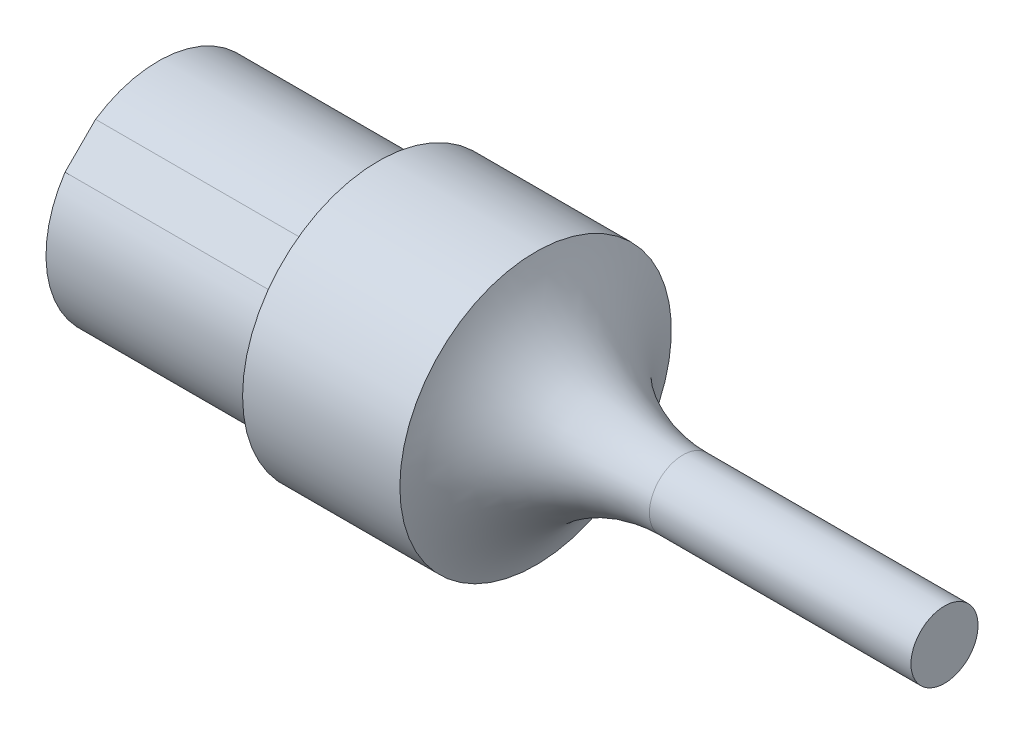
ISO-10303-21;
HEADER;
FILE_DESCRIPTION(('STEP AP214'),'2;1');
FILE_NAME('part.step','',(''),(''),'','','');
FILE_SCHEMA(('AUTOMOTIVE_DESIGN { 1 0 10303 214 1 1 1 1 }'));
ENDSEC;
DATA;
#1=APPLICATION_CONTEXT('core data for automotive mechanical design processes');
#2=APPLICATION_PROTOCOL_DEFINITION('international standard','automotive_design',2000,#1);
#3=PRODUCT_CONTEXT('',#1,'mechanical');
#4=PRODUCT('Part','Part','',(#3));
#5=PRODUCT_RELATED_PRODUCT_CATEGORY('part','',(#4));
#6=PRODUCT_DEFINITION_FORMATION('','',#4);
#7=PRODUCT_DEFINITION_CONTEXT('part definition',#1,'design');
#8=PRODUCT_DEFINITION('design','',#6,#7);
#9=PRODUCT_DEFINITION_SHAPE('','',#8);
#10=(LENGTH_UNIT() NAMED_UNIT(*) SI_UNIT(.MILLI.,.METRE.));
#11=(NAMED_UNIT(*) PLANE_ANGLE_UNIT() SI_UNIT($,.RADIAN.));
#12=(NAMED_UNIT(*) SI_UNIT($,.STERADIAN.) SOLID_ANGLE_UNIT());
#13=UNCERTAINTY_MEASURE_WITH_UNIT(LENGTH_MEASURE(1.E-05),#10,'distance_accuracy_value','');
#14=(GEOMETRIC_REPRESENTATION_CONTEXT(3) GLOBAL_UNCERTAINTY_ASSIGNED_CONTEXT((#13)) GLOBAL_UNIT_ASSIGNED_CONTEXT((#10,
#11,#12)) REPRESENTATION_CONTEXT('',''));
#15=CARTESIAN_POINT('',(0.,0.,0.));
#16=DIRECTION('',(0.,0.,1.));
#17=DIRECTION('',(1.,0.,0.));
#18=AXIS2_PLACEMENT_3D('',#15,#16,#17);
#19=CARTESIAN_POINT('',(-32.6819687334393,0.,1.5350554412521));
#20=DIRECTION('',(-1.,0.,0.));
#21=DIRECTION('',(0.,0.,1.));
#22=AXIS2_PLACEMENT_3D('',#19,#20,#21);
#23=CYLINDRICAL_SURFACE('',#22,7.13309465693838);
#24=CARTESIAN_POINT('',(-32.6819687334393,0.,1.5350554412521));
#25=DIRECTION('',(-1.,0.,0.));
#26=DIRECTION('',(0.,0.,1.));
#27=AXIS2_PLACEMENT_3D('',#24,#25,#26);
#28=CIRCLE('',#27,7.13309465693838);
#29=CARTESIAN_POINT('',(-32.6819687334393,5.9195514136584,5.51499896420536));
#30=VERTEX_POINT('',#29);
#31=CARTESIAN_POINT('',(-32.6819687334393,3.97994352295326,7.4546068549105));
#32=VERTEX_POINT('',#31);
#33=EDGE_CURVE('E67',#30,#32,#28,.T.);
#34=ORIENTED_EDGE('',*,*,#33,.F.);
#35=DIRECTION('',(-1.,0.,0.));
#36=VECTOR('',#35,1.);
#37=CARTESIAN_POINT('',(-5.93894894871822,5.9195514136584,5.51499896420536));
#38=LINE('',#37,#36);
#39=CARTESIAN_POINT('',(-18.6819687334393,5.9195514136584,5.51499896420536));
#40=VERTEX_POINT('',#39);
#41=EDGE_CURVE('E55',#40,#30,#38,.T.);
#42=ORIENTED_EDGE('',*,*,#41,.F.);
#43=CARTESIAN_POINT('',(-18.6819687334393,0.,1.5350554412521));
#44=DIRECTION('',(-1.,0.,0.));
#45=DIRECTION('',(0.,0.,1.));
#46=AXIS2_PLACEMENT_3D('',#43,#44,#45);
#47=CIRCLE('',#46,7.13309465693838);
#48=CARTESIAN_POINT('',(-18.6819687334393,3.97994352295326,7.4546068549105));
#49=VERTEX_POINT('',#48);
#50=EDGE_CURVE('E70',#40,#49,#47,.T.);
#51=ORIENTED_EDGE('',*,*,#50,.T.);
#52=DIRECTION('',(-1.,0.,0.));
#53=VECTOR('',#52,1.);
#54=CARTESIAN_POINT('',(-5.93894894871822,3.97994352295326,7.4546068549105));
#55=LINE('',#54,#53);
#56=EDGE_CURVE('E62',#49,#32,#55,.T.);
#57=ORIENTED_EDGE('',*,*,#56,.T.);
#58=EDGE_LOOP('',(#34,#42,#51,#57));
#59=FACE_BOUND('',#58,.T.);
#60=ADVANCED_FACE('F33',(#59),#23,.T.);
#61=CARTESIAN_POINT('',(-32.6819687334393,0.,0.));
#62=DIRECTION('',(1.,0.,0.));
#63=DIRECTION('',(0.,0.,-1.));
#64=AXIS2_PLACEMENT_3D('',#61,#62,#63);
#65=PLANE('',#64);
#66=ORIENTED_EDGE('',*,*,#33,.T.);
#67=DIRECTION('',(0.,-0.707106781186548,0.707106781186548));
#68=VECTOR('',#67,1.);
#69=CARTESIAN_POINT('',(-32.6819687334393,5.9195514136584,5.51499896420536));
#70=LINE('',#69,#68);
#71=EDGE_CURVE('E59',#30,#32,#70,.T.);
#72=ORIENTED_EDGE('',*,*,#71,.F.);
#73=EDGE_LOOP('',(#66,#72));
#74=FACE_BOUND('',#73,.T.);
#75=ADVANCED_FACE('F72',(#74),#65,.F.);
#76=CARTESIAN_POINT('',(17.3180312665607,0.,0.));
#77=DIRECTION('',(-1.,0.,0.));
#78=DIRECTION('',(0.,0.,1.));
#79=AXIS2_PLACEMENT_3D('',#76,#77,#78);
#80=PLANE('',#79);
#81=CARTESIAN_POINT('',(17.3180312665607,0.,1.5350554412521));
#82=DIRECTION('',(-1.,0.,0.));
#83=DIRECTION('',(0.,0.,1.));
#84=AXIS2_PLACEMENT_3D('',#81,#82,#83);
#85=CIRCLE('',#84,2.13309465693838);
#86=CARTESIAN_POINT('',(17.3180312665607,0.,3.66815009819048));
#87=VERTEX_POINT('',#86);
#88=EDGE_CURVE('E41',#87,#87,#85,.T.);
#89=ORIENTED_EDGE('',*,*,#88,.F.);
#90=EDGE_LOOP('',(#89));
#91=FACE_BOUND('',#90,.T.);
#92=ADVANCED_FACE('F87',(#91),#80,.F.);
#93=CARTESIAN_POINT('',(-32.6819687334393,0.,1.5350554412521));
#94=DIRECTION('',(-1.,0.,0.));
#95=DIRECTION('',(0.,0.,1.));
#96=AXIS2_PLACEMENT_3D('',#93,#94,#95);
#97=CYLINDRICAL_SURFACE('',#96,2.13309465693838);
#98=CARTESIAN_POINT('',(0.685528264158297,0.,1.5350554412521));
#99=DIRECTION('',(-1.,0.,0.));
#100=DIRECTION('',(0.,0.,1.));
#101=AXIS2_PLACEMENT_3D('',#98,#99,#100);
#102=CIRCLE('',#101,2.13309465693838);
#103=CARTESIAN_POINT('',(0.685528264158297,0.,3.66815009819048));
#104=VERTEX_POINT('',#103);
#105=EDGE_CURVE('E11',#104,#104,#102,.F.);
#106=ORIENTED_EDGE('',*,*,#105,.T.);
#107=EDGE_LOOP('',(#106));
#108=FACE_BOUND('',#107,.T.);
#109=ORIENTED_EDGE('',*,*,#88,.T.);
#110=EDGE_LOOP('',(#109));
#111=FACE_BOUND('',#110,.T.);
#112=ADVANCED_FACE('F85',(#108,#111),#97,.T.);
#113=CARTESIAN_POINT('',(-32.6819687334393,0.,1.5350554412521));
#114=DIRECTION('',(-1.,0.,0.));
#115=DIRECTION('',(0.,0.,1.));
#116=AXIS2_PLACEMENT_3D('',#113,#114,#115);
#117=CYLINDRICAL_SURFACE('',#116,8.63309465693838);
#118=CARTESIAN_POINT('',(-8.6819687334393,0.,1.5350554412521));
#119=DIRECTION('',(-1.,0.,0.));
#120=DIRECTION('',(0.,0.,1.));
#121=AXIS2_PLACEMENT_3D('',#118,#119,#120);
#122=CIRCLE('',#121,8.63309465693838);
#123=CARTESIAN_POINT('',(-8.6819687334393,0.,10.1681500981905));
#124=VERTEX_POINT('',#123);
#125=EDGE_CURVE('E80',#124,#124,#122,.T.);
#126=ORIENTED_EDGE('',*,*,#125,.T.);
#127=EDGE_LOOP('',(#126));
#128=FACE_BOUND('',#127,.T.);
#129=CARTESIAN_POINT('',(-18.6819687334393,0.,1.5350554412521));
#130=DIRECTION('',(-1.,0.,0.));
#131=DIRECTION('',(0.,0.,1.));
#132=AXIS2_PLACEMENT_3D('',#129,#130,#131);
#133=CIRCLE('',#132,8.63309465693838);
#134=CARTESIAN_POINT('',(-18.6819687334393,0.,10.1681500981905));
#135=VERTEX_POINT('',#134);
#136=EDGE_CURVE('E74',#135,#135,#133,.T.);
#137=ORIENTED_EDGE('',*,*,#136,.F.);
#138=EDGE_LOOP('',(#137));
#139=FACE_BOUND('',#138,.T.);
#140=ADVANCED_FACE('F94',(#128,#139),#117,.T.);
#141=CARTESIAN_POINT('',(-18.6819687334393,0.,0.));
#142=DIRECTION('',(1.,0.,0.));
#143=DIRECTION('',(0.,0.,-1.));
#144=AXIS2_PLACEMENT_3D('',#141,#142,#143);
#145=PLANE('',#144);
#146=ORIENTED_EDGE('',*,*,#50,.F.);
#147=DIRECTION('',(0.,-0.707106781186548,0.707106781186548));
#148=VECTOR('',#147,1.);
#149=CARTESIAN_POINT('',(-18.6819687334393,5.9195514136584,5.51499896420536));
#150=LINE('',#149,#148);
#151=EDGE_CURVE('E47',#40,#49,#150,.T.);
#152=ORIENTED_EDGE('',*,*,#151,.T.);
#153=EDGE_LOOP('',(#146,#152));
#154=FACE_BOUND('',#153,.T.);
#155=ORIENTED_EDGE('',*,*,#136,.T.);
#156=EDGE_LOOP('',(#155));
#157=FACE_BOUND('',#156,.T.);
#158=ADVANCED_FACE('F105',(#154,#157),#145,.F.);
#159=CARTESIAN_POINT('',(0.685528264158295,0.,1.5350554412521));
#160=DIRECTION('',(-1.,0.,0.));
#161=DIRECTION('',(0.,0.,1.));
#162=AXIS2_PLACEMENT_3D('',#159,#160,#161);
#163=TOROIDAL_SURFACE('',#162,12.1330946569384,10.);
#164=ORIENTED_EDGE('',*,*,#105,.F.);
#165=EDGE_LOOP('',(#164));
#166=FACE_BOUND('',#165,.T.);
#167=ORIENTED_EDGE('',*,*,#125,.F.);
#168=EDGE_LOOP('',(#167));
#169=FACE_BOUND('',#168,.T.);
#170=ADVANCED_FACE('F35',(#166,#169),#163,.F.);
#171=CARTESIAN_POINT('',(-5.93894894871822,5.9195514136584,5.51499896420536));
#172=DIRECTION('',(0.,-0.707106781186547,-0.707106781186547));
#173=DIRECTION('',(0.,0.707106781186548,-0.707106781186548));
#174=AXIS2_PLACEMENT_3D('',#171,#172,#173);
#175=PLANE('',#174);
#176=ORIENTED_EDGE('',*,*,#41,.T.);
#177=ORIENTED_EDGE('',*,*,#71,.T.);
#178=ORIENTED_EDGE('',*,*,#56,.F.);
#179=ORIENTED_EDGE('',*,*,#151,.F.);
#180=EDGE_LOOP('',(#176,#177,#178,#179));
#181=FACE_BOUND('',#180,.T.);
#182=ADVANCED_FACE('F61',(#181),#175,.F.);
#183=CLOSED_SHELL('',(#60,#75,#92,#112,#140,#158,#170,#182));
#184=MANIFOLD_SOLID_BREP('B2',#183);
#185=ADVANCED_BREP_SHAPE_REPRESENTATION('',(#18,#184),#14);
#186=SHAPE_DEFINITION_REPRESENTATION(#9,#185);
ENDSEC;
END-ISO-10303-21;
